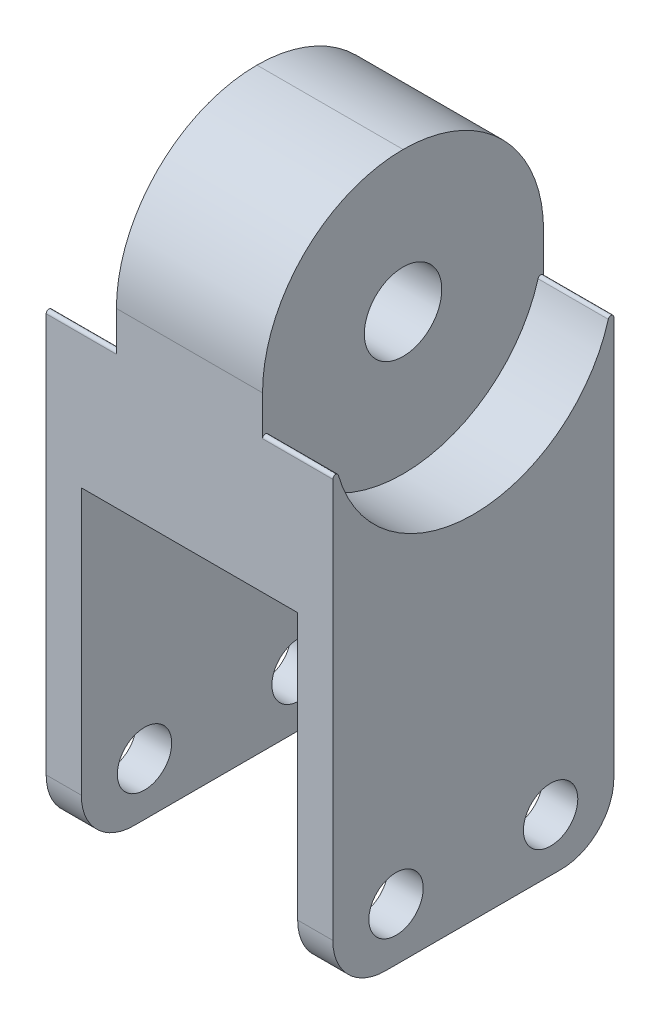
ISO-10303-21;
HEADER;
FILE_DESCRIPTION(('STEP AP214'),'2;1');
FILE_NAME('part.step','',(''),(''),'','','');
FILE_SCHEMA(('AUTOMOTIVE_DESIGN { 1 0 10303 214 1 1 1 1 }'));
ENDSEC;
DATA;
#1=APPLICATION_CONTEXT('core data for automotive mechanical design processes');
#2=APPLICATION_PROTOCOL_DEFINITION('international standard','automotive_design',2000,#1);
#3=PRODUCT_CONTEXT('',#1,'mechanical');
#4=PRODUCT('Part','Part','',(#3));
#5=PRODUCT_RELATED_PRODUCT_CATEGORY('part','',(#4));
#6=PRODUCT_DEFINITION_FORMATION('','',#4);
#7=PRODUCT_DEFINITION_CONTEXT('part definition',#1,'design');
#8=PRODUCT_DEFINITION('design','',#6,#7);
#9=PRODUCT_DEFINITION_SHAPE('','',#8);
#10=(LENGTH_UNIT() NAMED_UNIT(*) SI_UNIT(.MILLI.,.METRE.));
#11=(NAMED_UNIT(*) PLANE_ANGLE_UNIT() SI_UNIT($,.RADIAN.));
#12=(NAMED_UNIT(*) SI_UNIT($,.STERADIAN.) SOLID_ANGLE_UNIT());
#13=UNCERTAINTY_MEASURE_WITH_UNIT(LENGTH_MEASURE(1.E-05),#10,'distance_accuracy_value','');
#14=(GEOMETRIC_REPRESENTATION_CONTEXT(3) GLOBAL_UNCERTAINTY_ASSIGNED_CONTEXT((#13)) GLOBAL_UNIT_ASSIGNED_CONTEXT((#10,
#11,#12)) REPRESENTATION_CONTEXT('',''));
#15=CARTESIAN_POINT('',(0.,0.,0.));
#16=DIRECTION('',(0.,0.,1.));
#17=DIRECTION('',(1.,0.,0.));
#18=AXIS2_PLACEMENT_3D('',#15,#16,#17);
#19=CARTESIAN_POINT('',(-6.604,12.954,12.7));
#20=DIRECTION('',(1.,0.,0.));
#21=DIRECTION('',(0.,0.,-1.));
#22=AXIS2_PLACEMENT_3D('',#19,#20,#21);
#23=PLANE('',#22);
#24=CARTESIAN_POINT('',(-6.604,21.8078975515723,12.446));
#25=DIRECTION('',(1.,0.,0.));
#26=DIRECTION('',(0.,0.,-1.));
#27=AXIS2_PLACEMENT_3D('',#24,#25,#26);
#28=CIRCLE('',#27,0.254);
#29=CARTESIAN_POINT('',(-6.604,21.8078975515723,12.7));
#30=VERTEX_POINT('',#29);
#31=CARTESIAN_POINT('',(-6.604,21.8783309329141,12.2019607843137));
#32=VERTEX_POINT('',#31);
#33=EDGE_CURVE('E214',#30,#32,#28,.F.);
#34=ORIENTED_EDGE('',*,*,#33,.F.);
#35=DIRECTION('',(0.,-1.,0.));
#36=VECTOR('',#35,1.);
#37=CARTESIAN_POINT('',(-6.604,12.954,12.7));
#38=LINE('',#37,#36);
#39=CARTESIAN_POINT('',(-6.604,25.4,12.7));
#40=VERTEX_POINT('',#39);
#41=EDGE_CURVE('E188',#40,#30,#38,.T.);
#42=ORIENTED_EDGE('',*,*,#41,.F.);
#43=CARTESIAN_POINT('',(-6.604,25.4,0.));
#44=DIRECTION('',(1.,0.,0.));
#45=DIRECTION('',(0.,0.,-1.));
#46=AXIS2_PLACEMENT_3D('',#43,#44,#45);
#47=CIRCLE('',#46,12.7);
#48=CARTESIAN_POINT('',(-6.604,38.1,0.));
#49=VERTEX_POINT('',#48);
#50=EDGE_CURVE('E353',#40,#49,#47,.F.);
#51=ORIENTED_EDGE('',*,*,#50,.T.);
#52=CARTESIAN_POINT('',(-6.604,25.4,0.));
#53=DIRECTION('',(1.,0.,0.));
#54=DIRECTION('',(0.,0.,-1.));
#55=AXIS2_PLACEMENT_3D('',#52,#53,#54);
#56=CIRCLE('',#55,12.7);
#57=CARTESIAN_POINT('',(-6.604,25.4,-12.7));
#58=VERTEX_POINT('',#57);
#59=EDGE_CURVE('E351',#49,#58,#56,.F.);
#60=ORIENTED_EDGE('',*,*,#59,.T.);
#61=DIRECTION('',(0.,-1.,0.));
#62=VECTOR('',#61,1.);
#63=CARTESIAN_POINT('',(-6.604,12.954,-12.7));
#64=LINE('',#63,#62);
#65=CARTESIAN_POINT('',(-6.604,21.8078975515723,-12.7));
#66=VERTEX_POINT('',#65);
#67=EDGE_CURVE('E268',#58,#66,#64,.T.);
#68=ORIENTED_EDGE('',*,*,#67,.T.);
#69=CARTESIAN_POINT('',(-6.604,21.8078975515723,-12.446));
#70=DIRECTION('',(1.,0.,0.));
#71=DIRECTION('',(0.,0.,-1.));
#72=AXIS2_PLACEMENT_3D('',#69,#70,#71);
#73=CIRCLE('',#72,0.254);
#74=CARTESIAN_POINT('',(-6.604,21.8783309329141,-12.2019607843137));
#75=VERTEX_POINT('',#74);
#76=EDGE_CURVE('E49',#75,#66,#73,.F.);
#77=ORIENTED_EDGE('',*,*,#76,.F.);
#78=CARTESIAN_POINT('',(-6.604,25.4,0.));
#79=DIRECTION('',(1.,0.,0.));
#80=DIRECTION('',(0.,0.,-1.));
#81=AXIS2_PLACEMENT_3D('',#78,#79,#80);
#82=CIRCLE('',#81,12.7);
#83=EDGE_CURVE('E237',#75,#32,#82,.F.);
#84=ORIENTED_EDGE('',*,*,#83,.T.);
#85=EDGE_LOOP('',(#34,#42,#51,#60,#68,#77,#84));
#86=FACE_BOUND('',#85,.T.);
#87=CARTESIAN_POINT('',(-6.604,25.4,0.));
#88=DIRECTION('',(-1.,0.,0.));
#89=DIRECTION('',(0.,0.,1.));
#90=AXIS2_PLACEMENT_3D('',#87,#88,#89);
#91=CIRCLE('',#90,3.5);
#92=CARTESIAN_POINT('',(-6.604,25.4,3.5));
#93=VERTEX_POINT('',#92);
#94=EDGE_CURVE('E239',#93,#93,#91,.T.);
#95=ORIENTED_EDGE('',*,*,#94,.F.);
#96=EDGE_LOOP('',(#95));
#97=FACE_BOUND('',#96,.T.);
#98=ADVANCED_FACE('F34',(#86,#97),#23,.F.);
#99=CARTESIAN_POINT('',(6.604,38.1,12.7));
#100=DIRECTION('',(-1.,0.,0.));
#101=DIRECTION('',(0.,0.,1.));
#102=AXIS2_PLACEMENT_3D('',#99,#100,#101);
#103=PLANE('',#102);
#104=CARTESIAN_POINT('',(6.604,21.8078975515723,12.446));
#105=DIRECTION('',(-1.,0.,0.));
#106=DIRECTION('',(0.,0.,1.));
#107=AXIS2_PLACEMENT_3D('',#104,#105,#106);
#108=CIRCLE('',#107,0.254);
#109=CARTESIAN_POINT('',(6.604,21.8783309329141,12.2019607843137));
#110=VERTEX_POINT('',#109);
#111=CARTESIAN_POINT('',(6.604,21.8078975515723,12.7));
#112=VERTEX_POINT('',#111);
#113=EDGE_CURVE('E212',#110,#112,#108,.F.);
#114=ORIENTED_EDGE('',*,*,#113,.F.);
#115=CARTESIAN_POINT('',(6.604,25.4,0.));
#116=DIRECTION('',(-1.,0.,0.));
#117=DIRECTION('',(0.,0.,1.));
#118=AXIS2_PLACEMENT_3D('',#115,#116,#117);
#119=CIRCLE('',#118,12.7);
#120=CARTESIAN_POINT('',(6.604,21.8783309329141,-12.2019607843137));
#121=VERTEX_POINT('',#120);
#122=EDGE_CURVE('E11',#110,#121,#119,.F.);
#123=ORIENTED_EDGE('',*,*,#122,.T.);
#124=CARTESIAN_POINT('',(6.604,21.8078975515723,-12.446));
#125=DIRECTION('',(-1.,0.,0.));
#126=DIRECTION('',(0.,0.,1.));
#127=AXIS2_PLACEMENT_3D('',#124,#125,#126);
#128=CIRCLE('',#127,0.254);
#129=CARTESIAN_POINT('',(6.604,21.8078975515723,-12.7));
#130=VERTEX_POINT('',#129);
#131=EDGE_CURVE('E223',#130,#121,#128,.F.);
#132=ORIENTED_EDGE('',*,*,#131,.F.);
#133=DIRECTION('',(0.,1.,0.));
#134=VECTOR('',#133,1.);
#135=CARTESIAN_POINT('',(6.604,38.1,-12.7));
#136=LINE('',#135,#134);
#137=CARTESIAN_POINT('',(6.604,25.4,-12.7));
#138=VERTEX_POINT('',#137);
#139=EDGE_CURVE('E269',#130,#138,#136,.T.);
#140=ORIENTED_EDGE('',*,*,#139,.T.);
#141=CARTESIAN_POINT('',(6.604,25.4,0.));
#142=DIRECTION('',(-1.,0.,0.));
#143=DIRECTION('',(0.,0.,1.));
#144=AXIS2_PLACEMENT_3D('',#141,#142,#143);
#145=CIRCLE('',#144,12.7);
#146=CARTESIAN_POINT('',(6.604,38.1,0.));
#147=VERTEX_POINT('',#146);
#148=EDGE_CURVE('E355',#138,#147,#145,.F.);
#149=ORIENTED_EDGE('',*,*,#148,.T.);
#150=CARTESIAN_POINT('',(6.604,25.4,0.));
#151=DIRECTION('',(-1.,0.,0.));
#152=DIRECTION('',(0.,0.,1.));
#153=AXIS2_PLACEMENT_3D('',#150,#151,#152);
#154=CIRCLE('',#153,12.7);
#155=CARTESIAN_POINT('',(6.604,25.4,12.7));
#156=VERTEX_POINT('',#155);
#157=EDGE_CURVE('E357',#147,#156,#154,.F.);
#158=ORIENTED_EDGE('',*,*,#157,.T.);
#159=DIRECTION('',(0.,1.,0.));
#160=VECTOR('',#159,1.);
#161=CARTESIAN_POINT('',(6.604,38.1,12.7));
#162=LINE('',#161,#160);
#163=EDGE_CURVE('E279',#112,#156,#162,.T.);
#164=ORIENTED_EDGE('',*,*,#163,.F.);
#165=EDGE_LOOP('',(#114,#123,#132,#140,#149,#158,#164));
#166=FACE_BOUND('',#165,.T.);
#167=CARTESIAN_POINT('',(6.604,25.4,0.));
#168=DIRECTION('',(-1.,0.,0.));
#169=DIRECTION('',(0.,0.,1.));
#170=AXIS2_PLACEMENT_3D('',#167,#168,#169);
#171=CIRCLE('',#170,3.5);
#172=CARTESIAN_POINT('',(6.604,25.4,3.5));
#173=VERTEX_POINT('',#172);
#174=EDGE_CURVE('E242',#173,#173,#171,.T.);
#175=ORIENTED_EDGE('',*,*,#174,.T.);
#176=EDGE_LOOP('',(#175));
#177=FACE_BOUND('',#176,.T.);
#178=ADVANCED_FACE('F398',(#166,#177),#103,.F.);
#179=CARTESIAN_POINT('',(12.954,12.954,12.7));
#180=DIRECTION('',(-1.,0.,0.));
#181=DIRECTION('',(0.,-1.,0.));
#182=AXIS2_PLACEMENT_3D('',#179,#180,#181);
#183=PLANE('',#182);
#184=CARTESIAN_POINT('',(12.954,-14.2875,6.985));
#185=DIRECTION('',(1.,0.,0.));
#186=DIRECTION('',(0.,0.,-1.));
#187=AXIS2_PLACEMENT_3D('',#184,#185,#186);
#188=CIRCLE('',#187,2.45745);
#189=CARTESIAN_POINT('',(12.954,-14.2875,4.52755));
#190=VERTEX_POINT('',#189);
#191=EDGE_CURVE('E246',#190,#190,#188,.T.);
#192=ORIENTED_EDGE('',*,*,#191,.F.);
#193=EDGE_LOOP('',(#192));
#194=FACE_BOUND('',#193,.T.);
#195=CARTESIAN_POINT('',(12.954,25.4,0.));
#196=DIRECTION('',(-1.,0.,0.));
#197=DIRECTION('',(0.,-1.,0.));
#198=AXIS2_PLACEMENT_3D('',#195,#196,#197);
#199=CIRCLE('',#198,12.7);
#200=CARTESIAN_POINT('',(12.954,21.8783309329141,-12.2019607843137));
#201=VERTEX_POINT('',#200);
#202=CARTESIAN_POINT('',(12.954,21.8783309329141,12.2019607843137));
#203=VERTEX_POINT('',#202);
#204=EDGE_CURVE('E217',#201,#203,#199,.T.);
#205=ORIENTED_EDGE('',*,*,#204,.T.);
#206=CARTESIAN_POINT('',(12.954,21.8078975515723,12.446));
#207=DIRECTION('',(-1.,0.,0.));
#208=DIRECTION('',(0.,-1.,0.));
#209=AXIS2_PLACEMENT_3D('',#206,#207,#208);
#210=CIRCLE('',#209,0.254);
#211=CARTESIAN_POINT('',(12.954,21.8078975515723,12.7));
#212=VERTEX_POINT('',#211);
#213=EDGE_CURVE('E209',#212,#203,#210,.T.);
#214=ORIENTED_EDGE('',*,*,#213,.F.);
#215=DIRECTION('',(0.,1.,0.));
#216=VECTOR('',#215,1.);
#217=CARTESIAN_POINT('',(12.954,12.954,12.7));
#218=LINE('',#217,#216);
#219=CARTESIAN_POINT('',(12.954,-14.2875,12.7));
#220=VERTEX_POINT('',#219);
#221=EDGE_CURVE('E277',#220,#212,#218,.T.);
#222=ORIENTED_EDGE('',*,*,#221,.F.);
#223=CARTESIAN_POINT('',(12.954,-14.2875,7.9375));
#224=DIRECTION('',(-1.,0.,0.));
#225=DIRECTION('',(0.,-1.,0.));
#226=AXIS2_PLACEMENT_3D('',#223,#224,#225);
#227=CIRCLE('',#226,4.7625);
#228=CARTESIAN_POINT('',(12.954,-19.05,7.9375));
#229=VERTEX_POINT('',#228);
#230=EDGE_CURVE('E341',#220,#229,#227,.F.);
#231=ORIENTED_EDGE('',*,*,#230,.T.);
#232=DIRECTION('',(0.,0.,-1.));
#233=VECTOR('',#232,1.);
#234=CARTESIAN_POINT('',(12.954,-19.05,12.7));
#235=LINE('',#234,#233);
#236=CARTESIAN_POINT('',(12.954,-19.05,-7.9375));
#237=VERTEX_POINT('',#236);
#238=EDGE_CURVE('E281',#229,#237,#235,.T.);
#239=ORIENTED_EDGE('',*,*,#238,.T.);
#240=CARTESIAN_POINT('',(12.954,-14.2875,-7.9375));
#241=DIRECTION('',(-1.,0.,0.));
#242=DIRECTION('',(0.,-1.,0.));
#243=AXIS2_PLACEMENT_3D('',#240,#241,#242);
#244=CIRCLE('',#243,4.7625);
#245=CARTESIAN_POINT('',(12.954,-14.2875,-12.7));
#246=VERTEX_POINT('',#245);
#247=EDGE_CURVE('E343',#237,#246,#244,.F.);
#248=ORIENTED_EDGE('',*,*,#247,.T.);
#249=DIRECTION('',(0.,1.,0.));
#250=VECTOR('',#249,1.);
#251=CARTESIAN_POINT('',(12.954,12.954,-12.7));
#252=LINE('',#251,#250);
#253=CARTESIAN_POINT('',(12.954,21.8078975515723,-12.7));
#254=VERTEX_POINT('',#253);
#255=EDGE_CURVE('E293',#246,#254,#252,.T.);
#256=ORIENTED_EDGE('',*,*,#255,.T.);
#257=CARTESIAN_POINT('',(12.954,21.8078975515723,-12.446));
#258=DIRECTION('',(-1.,0.,0.));
#259=DIRECTION('',(0.,-1.,0.));
#260=AXIS2_PLACEMENT_3D('',#257,#258,#259);
#261=CIRCLE('',#260,0.254);
#262=EDGE_CURVE('E219',#201,#254,#261,.T.);
#263=ORIENTED_EDGE('',*,*,#262,.F.);
#264=EDGE_LOOP('',(#205,#214,#222,#231,#239,#248,#256,#263));
#265=FACE_BOUND('',#264,.T.);
#266=CARTESIAN_POINT('',(12.954,-14.2875,-6.985));
#267=DIRECTION('',(1.,0.,0.));
#268=DIRECTION('',(0.,0.,-1.));
#269=AXIS2_PLACEMENT_3D('',#266,#267,#268);
#270=CIRCLE('',#269,2.45745);
#271=CARTESIAN_POINT('',(12.954,-14.2875,-9.44245));
#272=VERTEX_POINT('',#271);
#273=EDGE_CURVE('E256',#272,#272,#270,.T.);
#274=ORIENTED_EDGE('',*,*,#273,.F.);
#275=EDGE_LOOP('',(#274));
#276=FACE_BOUND('',#275,.T.);
#277=ADVANCED_FACE('F403',(#194,#265,#276),#183,.F.);
#278=CARTESIAN_POINT('',(-12.954,-19.05,12.7));
#279=DIRECTION('',(1.,0.,0.));
#280=DIRECTION('',(0.,0.,-1.));
#281=AXIS2_PLACEMENT_3D('',#278,#279,#280);
#282=PLANE('',#281);
#283=CARTESIAN_POINT('',(-12.954,-14.2875,6.985));
#284=DIRECTION('',(1.,0.,0.));
#285=DIRECTION('',(0.,0.,-1.));
#286=AXIS2_PLACEMENT_3D('',#283,#284,#285);
#287=CIRCLE('',#286,2.45744999999999);
#288=CARTESIAN_POINT('',(-12.954,-14.2875,4.52755000000001));
#289=VERTEX_POINT('',#288);
#290=EDGE_CURVE('E249',#289,#289,#287,.T.);
#291=ORIENTED_EDGE('',*,*,#290,.T.);
#292=EDGE_LOOP('',(#291));
#293=FACE_BOUND('',#292,.T.);
#294=CARTESIAN_POINT('',(-12.954,-14.2875,-6.985));
#295=DIRECTION('',(1.,0.,0.));
#296=DIRECTION('',(0.,0.,-1.));
#297=AXIS2_PLACEMENT_3D('',#294,#295,#296);
#298=CIRCLE('',#297,2.45744999999999);
#299=CARTESIAN_POINT('',(-12.954,-14.2875,-9.44244999999999));
#300=VERTEX_POINT('',#299);
#301=EDGE_CURVE('E259',#300,#300,#298,.T.);
#302=ORIENTED_EDGE('',*,*,#301,.T.);
#303=EDGE_LOOP('',(#302));
#304=FACE_BOUND('',#303,.T.);
#305=CARTESIAN_POINT('',(-12.954,21.8078975515723,12.446));
#306=DIRECTION('',(1.,0.,0.));
#307=DIRECTION('',(0.,0.,-1.));
#308=AXIS2_PLACEMENT_3D('',#305,#306,#307);
#309=CIRCLE('',#308,0.254);
#310=CARTESIAN_POINT('',(-12.954,21.8783309329141,12.2019607843137));
#311=VERTEX_POINT('',#310);
#312=CARTESIAN_POINT('',(-12.954,21.8078975515723,12.7));
#313=VERTEX_POINT('',#312);
#314=EDGE_CURVE('E180',#311,#313,#309,.T.);
#315=ORIENTED_EDGE('',*,*,#314,.F.);
#316=CARTESIAN_POINT('',(-12.954,25.4,0.));
#317=DIRECTION('',(1.,0.,0.));
#318=DIRECTION('',(0.,0.,-1.));
#319=AXIS2_PLACEMENT_3D('',#316,#317,#318);
#320=CIRCLE('',#319,12.7);
#321=CARTESIAN_POINT('',(-12.954,21.8783309329141,-12.2019607843137));
#322=VERTEX_POINT('',#321);
#323=EDGE_CURVE('E226',#311,#322,#320,.T.);
#324=ORIENTED_EDGE('',*,*,#323,.T.);
#325=CARTESIAN_POINT('',(-12.954,21.8078975515723,-12.446));
#326=DIRECTION('',(1.,0.,0.));
#327=DIRECTION('',(0.,0.,-1.));
#328=AXIS2_PLACEMENT_3D('',#325,#326,#327);
#329=CIRCLE('',#328,0.254);
#330=CARTESIAN_POINT('',(-12.954,21.8078975515723,-12.7));
#331=VERTEX_POINT('',#330);
#332=EDGE_CURVE('E216',#331,#322,#329,.T.);
#333=ORIENTED_EDGE('',*,*,#332,.F.);
#334=DIRECTION('',(0.,-1.,0.));
#335=VECTOR('',#334,1.);
#336=CARTESIAN_POINT('',(-12.954,-19.05,-12.7));
#337=LINE('',#336,#335);
#338=CARTESIAN_POINT('',(-12.954,-14.2875,-12.7));
#339=VERTEX_POINT('',#338);
#340=EDGE_CURVE('E283',#331,#339,#337,.T.);
#341=ORIENTED_EDGE('',*,*,#340,.T.);
#342=CARTESIAN_POINT('',(-12.954,-14.2875,-7.9375));
#343=DIRECTION('',(1.,0.,0.));
#344=DIRECTION('',(0.,0.,-1.));
#345=AXIS2_PLACEMENT_3D('',#342,#343,#344);
#346=CIRCLE('',#345,4.7625);
#347=CARTESIAN_POINT('',(-12.954,-19.05,-7.9375));
#348=VERTEX_POINT('',#347);
#349=EDGE_CURVE('E329',#339,#348,#346,.F.);
#350=ORIENTED_EDGE('',*,*,#349,.T.);
#351=DIRECTION('',(0.,0.,-1.));
#352=VECTOR('',#351,1.);
#353=CARTESIAN_POINT('',(-12.954,-19.05,12.7));
#354=LINE('',#353,#352);
#355=CARTESIAN_POINT('',(-12.954,-19.05,7.9375));
#356=VERTEX_POINT('',#355);
#357=EDGE_CURVE('E310',#356,#348,#354,.T.);
#358=ORIENTED_EDGE('',*,*,#357,.F.);
#359=CARTESIAN_POINT('',(-12.954,-14.2875,7.9375));
#360=DIRECTION('',(1.,0.,0.));
#361=DIRECTION('',(0.,0.,-1.));
#362=AXIS2_PLACEMENT_3D('',#359,#360,#361);
#363=CIRCLE('',#362,4.7625);
#364=CARTESIAN_POINT('',(-12.954,-14.2875,12.7));
#365=VERTEX_POINT('',#364);
#366=EDGE_CURVE('E183',#356,#365,#363,.F.);
#367=ORIENTED_EDGE('',*,*,#366,.T.);
#368=DIRECTION('',(0.,-1.,0.));
#369=VECTOR('',#368,1.);
#370=CARTESIAN_POINT('',(-12.954,-19.05,12.7));
#371=LINE('',#370,#369);
#372=EDGE_CURVE('E175',#313,#365,#371,.T.);
#373=ORIENTED_EDGE('',*,*,#372,.F.);
#374=EDGE_LOOP('',(#315,#324,#333,#341,#350,#358,#367,#373));
#375=FACE_BOUND('',#374,.T.);
#376=ADVANCED_FACE('F177',(#293,#304,#375),#282,.F.);
#377=CARTESIAN_POINT('',(-9.779,-19.05,12.7));
#378=DIRECTION('',(0.,1.,0.));
#379=DIRECTION('',(-1.,0.,0.));
#380=AXIS2_PLACEMENT_3D('',#377,#378,#379);
#381=PLANE('',#380);
#382=DIRECTION('',(0.,0.,-1.));
#383=VECTOR('',#382,1.);
#384=CARTESIAN_POINT('',(-9.779,-19.05,12.7));
#385=LINE('',#384,#383);
#386=CARTESIAN_POINT('',(-9.779,-19.05,7.9375));
#387=VERTEX_POINT('',#386);
#388=CARTESIAN_POINT('',(-9.779,-19.05,-7.9375));
#389=VERTEX_POINT('',#388);
#390=EDGE_CURVE('E307',#387,#389,#385,.T.);
#391=ORIENTED_EDGE('',*,*,#390,.F.);
#392=DIRECTION('',(1.,0.,0.));
#393=VECTOR('',#392,1.);
#394=CARTESIAN_POINT('',(-9.779,-19.05,7.9375));
#395=LINE('',#394,#393);
#396=EDGE_CURVE('E327',#387,#356,#395,.F.);
#397=ORIENTED_EDGE('',*,*,#396,.T.);
#398=ORIENTED_EDGE('',*,*,#357,.T.);
#399=DIRECTION('',(1.,0.,0.));
#400=VECTOR('',#399,1.);
#401=CARTESIAN_POINT('',(-9.779,-19.05,-7.9375));
#402=LINE('',#401,#400);
#403=EDGE_CURVE('E324',#348,#389,#402,.T.);
#404=ORIENTED_EDGE('',*,*,#403,.T.);
#405=EDGE_LOOP('',(#391,#397,#398,#404));
#406=FACE_BOUND('',#405,.T.);
#407=ADVANCED_FACE('F525',(#406),#381,.F.);
#408=CARTESIAN_POINT('',(-9.779,9.779,12.7));
#409=DIRECTION('',(-1.,0.,0.));
#410=DIRECTION('',(0.,-1.,0.));
#411=AXIS2_PLACEMENT_3D('',#408,#409,#410);
#412=PLANE('',#411);
#413=CARTESIAN_POINT('',(-9.779,-14.2875,6.985));
#414=DIRECTION('',(-1.,0.,0.));
#415=DIRECTION('',(0.,-1.,0.));
#416=AXIS2_PLACEMENT_3D('',#413,#414,#415);
#417=CIRCLE('',#416,2.45744999999999);
#418=CARTESIAN_POINT('',(-9.779,-16.74495,6.985));
#419=VERTEX_POINT('',#418);
#420=EDGE_CURVE('E252',#419,#419,#417,.T.);
#421=ORIENTED_EDGE('',*,*,#420,.T.);
#422=EDGE_LOOP('',(#421));
#423=FACE_BOUND('',#422,.T.);
#424=CARTESIAN_POINT('',(-9.779,-14.2875,-6.985));
#425=DIRECTION('',(-1.,0.,0.));
#426=DIRECTION('',(0.,-1.,0.));
#427=AXIS2_PLACEMENT_3D('',#424,#425,#426);
#428=CIRCLE('',#427,2.45744999999999);
#429=CARTESIAN_POINT('',(-9.779,-16.74495,-6.985));
#430=VERTEX_POINT('',#429);
#431=EDGE_CURVE('E262',#430,#430,#428,.T.);
#432=ORIENTED_EDGE('',*,*,#431,.T.);
#433=EDGE_LOOP('',(#432));
#434=FACE_BOUND('',#433,.T.);
#435=DIRECTION('',(0.,1.,0.));
#436=VECTOR('',#435,1.);
#437=CARTESIAN_POINT('',(-9.779,9.779,12.7));
#438=LINE('',#437,#436);
#439=CARTESIAN_POINT('',(-9.779,-14.2875,12.7));
#440=VERTEX_POINT('',#439);
#441=CARTESIAN_POINT('',(-9.779,9.779,12.7));
#442=VERTEX_POINT('',#441);
#443=EDGE_CURVE('E187',#440,#442,#438,.T.);
#444=ORIENTED_EDGE('',*,*,#443,.F.);
#445=CARTESIAN_POINT('',(-9.779,-14.2875,7.9375));
#446=DIRECTION('',(-1.,0.,0.));
#447=DIRECTION('',(0.,-1.,0.));
#448=AXIS2_PLACEMENT_3D('',#445,#446,#447);
#449=CIRCLE('',#448,4.7625);
#450=EDGE_CURVE('E322',#440,#387,#449,.F.);
#451=ORIENTED_EDGE('',*,*,#450,.T.);
#452=ORIENTED_EDGE('',*,*,#390,.T.);
#453=CARTESIAN_POINT('',(-9.779,-14.2875,-7.9375));
#454=DIRECTION('',(-1.,0.,0.));
#455=DIRECTION('',(0.,-1.,0.));
#456=AXIS2_PLACEMENT_3D('',#453,#454,#455);
#457=CIRCLE('',#456,4.7625);
#458=CARTESIAN_POINT('',(-9.779,-14.2875,-12.7));
#459=VERTEX_POINT('',#458);
#460=EDGE_CURVE('E320',#389,#459,#457,.F.);
#461=ORIENTED_EDGE('',*,*,#460,.T.);
#462=DIRECTION('',(0.,1.,0.));
#463=VECTOR('',#462,1.);
#464=CARTESIAN_POINT('',(-9.779,9.779,-12.7));
#465=LINE('',#464,#463);
#466=CARTESIAN_POINT('',(-9.779,9.779,-12.7));
#467=VERTEX_POINT('',#466);
#468=EDGE_CURVE('E286',#459,#467,#465,.T.);
#469=ORIENTED_EDGE('',*,*,#468,.T.);
#470=DIRECTION('',(0.,0.,-1.));
#471=VECTOR('',#470,1.);
#472=CARTESIAN_POINT('',(-9.779,9.779,12.7));
#473=LINE('',#472,#471);
#474=EDGE_CURVE('E304',#442,#467,#473,.T.);
#475=ORIENTED_EDGE('',*,*,#474,.F.);
#476=EDGE_LOOP('',(#444,#451,#452,#461,#469,#475));
#477=FACE_BOUND('',#476,.T.);
#478=ADVANCED_FACE('F518',(#423,#434,#477),#412,.F.);
#479=CARTESIAN_POINT('',(-9.779,9.779,12.7));
#480=DIRECTION('',(0.,1.,0.));
#481=DIRECTION('',(0.,0.,1.));
#482=AXIS2_PLACEMENT_3D('',#479,#480,#481);
#483=PLANE('',#482);
#484=DIRECTION('',(1.,0.,0.));
#485=VECTOR('',#484,1.);
#486=CARTESIAN_POINT('',(-9.779,9.779,-12.7));
#487=LINE('',#486,#485);
#488=CARTESIAN_POINT('',(9.779,9.779,-12.7));
#489=VERTEX_POINT('',#488);
#490=EDGE_CURVE('E288',#467,#489,#487,.T.);
#491=ORIENTED_EDGE('',*,*,#490,.T.);
#492=DIRECTION('',(0.,0.,-1.));
#493=VECTOR('',#492,1.);
#494=CARTESIAN_POINT('',(9.779,9.779,12.7));
#495=LINE('',#494,#493);
#496=CARTESIAN_POINT('',(9.779,9.779,12.7));
#497=VERTEX_POINT('',#496);
#498=EDGE_CURVE('E301',#497,#489,#495,.T.);
#499=ORIENTED_EDGE('',*,*,#498,.F.);
#500=DIRECTION('',(1.,0.,0.));
#501=VECTOR('',#500,1.);
#502=CARTESIAN_POINT('',(-9.779,9.779,12.7));
#503=LINE('',#502,#501);
#504=EDGE_CURVE('E272',#442,#497,#503,.T.);
#505=ORIENTED_EDGE('',*,*,#504,.F.);
#506=ORIENTED_EDGE('',*,*,#474,.T.);
#507=EDGE_LOOP('',(#491,#499,#505,#506));
#508=FACE_BOUND('',#507,.T.);
#509=ADVANCED_FACE('F510',(#508),#483,.F.);
#510=CARTESIAN_POINT('',(9.779,-19.05,12.7));
#511=DIRECTION('',(1.,0.,0.));
#512=DIRECTION('',(0.,1.,0.));
#513=AXIS2_PLACEMENT_3D('',#510,#511,#512);
#514=PLANE('',#513);
#515=CARTESIAN_POINT('',(9.779,-14.2875,6.985));
#516=DIRECTION('',(1.,0.,0.));
#517=DIRECTION('',(0.,1.,0.));
#518=AXIS2_PLACEMENT_3D('',#515,#516,#517);
#519=CIRCLE('',#518,2.45744999999999);
#520=CARTESIAN_POINT('',(9.779,-11.83005,6.985));
#521=VERTEX_POINT('',#520);
#522=EDGE_CURVE('E253',#521,#521,#519,.T.);
#523=ORIENTED_EDGE('',*,*,#522,.T.);
#524=EDGE_LOOP('',(#523));
#525=FACE_BOUND('',#524,.T.);
#526=CARTESIAN_POINT('',(9.779,-14.2875,-6.985));
#527=DIRECTION('',(1.,0.,0.));
#528=DIRECTION('',(0.,1.,0.));
#529=AXIS2_PLACEMENT_3D('',#526,#527,#528);
#530=CIRCLE('',#529,2.45744999999999);
#531=CARTESIAN_POINT('',(9.779,-11.83005,-6.985));
#532=VERTEX_POINT('',#531);
#533=EDGE_CURVE('E265',#532,#532,#530,.T.);
#534=ORIENTED_EDGE('',*,*,#533,.T.);
#535=EDGE_LOOP('',(#534));
#536=FACE_BOUND('',#535,.T.);
#537=DIRECTION('',(0.,-1.,0.));
#538=VECTOR('',#537,1.);
#539=CARTESIAN_POINT('',(9.779,-19.05,-12.7));
#540=LINE('',#539,#538);
#541=CARTESIAN_POINT('',(9.779,-14.2875,-12.7));
#542=VERTEX_POINT('',#541);
#543=EDGE_CURVE('E290',#489,#542,#540,.T.);
#544=ORIENTED_EDGE('',*,*,#543,.T.);
#545=CARTESIAN_POINT('',(9.779,-14.2875,-7.9375));
#546=DIRECTION('',(1.,0.,0.));
#547=DIRECTION('',(0.,1.,0.));
#548=AXIS2_PLACEMENT_3D('',#545,#546,#547);
#549=CIRCLE('',#548,4.7625);
#550=CARTESIAN_POINT('',(9.779,-19.05,-7.9375));
#551=VERTEX_POINT('',#550);
#552=EDGE_CURVE('E347',#542,#551,#549,.F.);
#553=ORIENTED_EDGE('',*,*,#552,.T.);
#554=DIRECTION('',(0.,0.,-1.));
#555=VECTOR('',#554,1.);
#556=CARTESIAN_POINT('',(9.779,-19.05,12.7));
#557=LINE('',#556,#555);
#558=CARTESIAN_POINT('',(9.779,-19.05,7.9375));
#559=VERTEX_POINT('',#558);
#560=EDGE_CURVE('E298',#559,#551,#557,.T.);
#561=ORIENTED_EDGE('',*,*,#560,.F.);
#562=CARTESIAN_POINT('',(9.779,-14.2875,7.9375));
#563=DIRECTION('',(1.,0.,0.));
#564=DIRECTION('',(0.,1.,0.));
#565=AXIS2_PLACEMENT_3D('',#562,#563,#564);
#566=CIRCLE('',#565,4.7625);
#567=CARTESIAN_POINT('',(9.779,-14.2875,12.7));
#568=VERTEX_POINT('',#567);
#569=EDGE_CURVE('E345',#559,#568,#566,.F.);
#570=ORIENTED_EDGE('',*,*,#569,.T.);
#571=DIRECTION('',(0.,-1.,0.));
#572=VECTOR('',#571,1.);
#573=CARTESIAN_POINT('',(9.779,-19.05,12.7));
#574=LINE('',#573,#572);
#575=EDGE_CURVE('E274',#497,#568,#574,.T.);
#576=ORIENTED_EDGE('',*,*,#575,.F.);
#577=ORIENTED_EDGE('',*,*,#498,.T.);
#578=EDGE_LOOP('',(#544,#553,#561,#570,#576,#577));
#579=FACE_BOUND('',#578,.T.);
#580=ADVANCED_FACE('F502',(#525,#536,#579),#514,.F.);
#581=CARTESIAN_POINT('',(12.954,-19.05,12.7));
#582=DIRECTION('',(0.,1.,0.));
#583=DIRECTION('',(-1.,0.,0.));
#584=AXIS2_PLACEMENT_3D('',#581,#582,#583);
#585=PLANE('',#584);
#586=ORIENTED_EDGE('',*,*,#560,.T.);
#587=DIRECTION('',(1.,0.,0.));
#588=VECTOR('',#587,1.);
#589=CARTESIAN_POINT('',(12.954,-19.05,-7.9375));
#590=LINE('',#589,#588);
#591=EDGE_CURVE('E338',#551,#237,#590,.T.);
#592=ORIENTED_EDGE('',*,*,#591,.T.);
#593=ORIENTED_EDGE('',*,*,#238,.F.);
#594=DIRECTION('',(1.,0.,0.));
#595=VECTOR('',#594,1.);
#596=CARTESIAN_POINT('',(12.954,-19.05,7.9375));
#597=LINE('',#596,#595);
#598=EDGE_CURVE('E336',#229,#559,#597,.F.);
#599=ORIENTED_EDGE('',*,*,#598,.T.);
#600=EDGE_LOOP('',(#586,#592,#593,#599));
#601=FACE_BOUND('',#600,.T.);
#602=ADVANCED_FACE('F495',(#601),#585,.F.);
#603=CARTESIAN_POINT('',(0.,0.,12.7));
#604=DIRECTION('',(0.,0.,-1.));
#605=DIRECTION('',(-1.,0.,0.));
#606=AXIS2_PLACEMENT_3D('',#603,#604,#605);
#607=PLANE('',#606);
#608=DIRECTION('',(-1.,0.,0.));
#609=VECTOR('',#608,1.);
#610=CARTESIAN_POINT('',(26.6082400856865,21.8078975515723,12.7));
#611=LINE('',#610,#609);
#612=EDGE_CURVE('E199',#212,#112,#611,.T.);
#613=ORIENTED_EDGE('',*,*,#612,.T.);
#614=ORIENTED_EDGE('',*,*,#163,.T.);
#615=DIRECTION('',(-1.,0.,0.));
#616=VECTOR('',#615,1.);
#617=CARTESIAN_POINT('',(0.,25.4,12.7));
#618=LINE('',#617,#616);
#619=EDGE_CURVE('E349',#156,#40,#618,.T.);
#620=ORIENTED_EDGE('',*,*,#619,.T.);
#621=ORIENTED_EDGE('',*,*,#41,.T.);
#622=EDGE_CURVE('E191',#30,#313,#611,.T.);
#623=ORIENTED_EDGE('',*,*,#622,.T.);
#624=ORIENTED_EDGE('',*,*,#372,.T.);
#625=DIRECTION('',(1.,0.,0.));
#626=VECTOR('',#625,1.);
#627=CARTESIAN_POINT('',(0.,-14.2875,12.7));
#628=LINE('',#627,#626);
#629=EDGE_CURVE('E318',#365,#440,#628,.T.);
#630=ORIENTED_EDGE('',*,*,#629,.T.);
#631=ORIENTED_EDGE('',*,*,#443,.T.);
#632=ORIENTED_EDGE('',*,*,#504,.T.);
#633=ORIENTED_EDGE('',*,*,#575,.T.);
#634=DIRECTION('',(1.,0.,0.));
#635=VECTOR('',#634,1.);
#636=CARTESIAN_POINT('',(0.,-14.2875,12.7));
#637=LINE('',#636,#635);
#638=EDGE_CURVE('E313',#568,#220,#637,.T.);
#639=ORIENTED_EDGE('',*,*,#638,.T.);
#640=ORIENTED_EDGE('',*,*,#221,.T.);
#641=EDGE_LOOP('',(#613,#614,#620,#621,#623,#624,#630,#631,#632,#633,#639,#640));
#642=FACE_BOUND('',#641,.T.);
#643=ADVANCED_FACE('F193',(#642),#607,.F.);
#644=CARTESIAN_POINT('',(0.,0.,-12.7));
#645=DIRECTION('',(0.,0.,-1.));
#646=DIRECTION('',(-1.,0.,0.));
#647=AXIS2_PLACEMENT_3D('',#644,#645,#646);
#648=PLANE('',#647);
#649=ORIENTED_EDGE('',*,*,#139,.F.);
#650=DIRECTION('',(-1.,0.,0.));
#651=VECTOR('',#650,1.);
#652=CARTESIAN_POINT('',(26.6082400856865,21.8078975515723,-12.7));
#653=LINE('',#652,#651);
#654=EDGE_CURVE('E229',#254,#130,#653,.T.);
#655=ORIENTED_EDGE('',*,*,#654,.F.);
#656=ORIENTED_EDGE('',*,*,#255,.F.);
#657=DIRECTION('',(1.,0.,0.));
#658=VECTOR('',#657,1.);
#659=CARTESIAN_POINT('',(9.779,-14.2875,-12.7));
#660=LINE('',#659,#658);
#661=EDGE_CURVE('E332',#246,#542,#660,.F.);
#662=ORIENTED_EDGE('',*,*,#661,.T.);
#663=ORIENTED_EDGE('',*,*,#543,.F.);
#664=ORIENTED_EDGE('',*,*,#490,.F.);
#665=ORIENTED_EDGE('',*,*,#468,.F.);
#666=DIRECTION('',(1.,0.,0.));
#667=VECTOR('',#666,1.);
#668=CARTESIAN_POINT('',(-12.954,-14.2875,-12.7));
#669=LINE('',#668,#667);
#670=EDGE_CURVE('E334',#459,#339,#669,.F.);
#671=ORIENTED_EDGE('',*,*,#670,.T.);
#672=ORIENTED_EDGE('',*,*,#340,.F.);
#673=EDGE_CURVE('E228',#66,#331,#653,.T.);
#674=ORIENTED_EDGE('',*,*,#673,.F.);
#675=ORIENTED_EDGE('',*,*,#67,.F.);
#676=DIRECTION('',(-1.,0.,0.));
#677=VECTOR('',#676,1.);
#678=CARTESIAN_POINT('',(6.604,25.4,-12.7));
#679=LINE('',#678,#677);
#680=EDGE_CURVE('E42',#58,#138,#679,.F.);
#681=ORIENTED_EDGE('',*,*,#680,.T.);
#682=EDGE_LOOP('',(#649,#655,#656,#662,#663,#664,#665,#671,#672,#674,#675,#681));
#683=FACE_BOUND('',#682,.T.);
#684=ADVANCED_FACE('F376',(#683),#648,.T.);
#685=CARTESIAN_POINT('',(12.954,-14.2875,-6.985));
#686=DIRECTION('',(1.,0.,0.));
#687=DIRECTION('',(0.,0.,-1.));
#688=AXIS2_PLACEMENT_3D('',#685,#686,#687);
#689=CYLINDRICAL_SURFACE('',#688,2.45744999999999);
#690=ORIENTED_EDGE('',*,*,#273,.T.);
#691=EDGE_LOOP('',(#690));
#692=FACE_BOUND('',#691,.T.);
#693=ORIENTED_EDGE('',*,*,#533,.F.);
#694=EDGE_LOOP('',(#693));
#695=FACE_BOUND('',#694,.T.);
#696=ADVANCED_FACE('F473',(#692,#695),#689,.F.);
#697=ORIENTED_EDGE('',*,*,#301,.F.);
#698=EDGE_LOOP('',(#697));
#699=FACE_BOUND('',#698,.T.);
#700=ORIENTED_EDGE('',*,*,#431,.F.);
#701=EDGE_LOOP('',(#700));
#702=FACE_BOUND('',#701,.T.);
#703=ADVANCED_FACE('F466',(#699,#702),#689,.F.);
#704=CARTESIAN_POINT('',(12.954,-14.2875,6.985));
#705=DIRECTION('',(1.,0.,0.));
#706=DIRECTION('',(0.,0.,-1.));
#707=AXIS2_PLACEMENT_3D('',#704,#705,#706);
#708=CYLINDRICAL_SURFACE('',#707,2.45744999999999);
#709=ORIENTED_EDGE('',*,*,#290,.F.);
#710=EDGE_LOOP('',(#709));
#711=FACE_BOUND('',#710,.T.);
#712=ORIENTED_EDGE('',*,*,#420,.F.);
#713=EDGE_LOOP('',(#712));
#714=FACE_BOUND('',#713,.T.);
#715=ADVANCED_FACE('F457',(#711,#714),#708,.F.);
#716=ORIENTED_EDGE('',*,*,#191,.T.);
#717=EDGE_LOOP('',(#716));
#718=FACE_BOUND('',#717,.T.);
#719=ORIENTED_EDGE('',*,*,#522,.F.);
#720=EDGE_LOOP('',(#719));
#721=FACE_BOUND('',#720,.T.);
#722=ADVANCED_FACE('F412',(#718,#721),#708,.F.);
#723=CARTESIAN_POINT('',(0.,-14.2875,7.9375));
#724=DIRECTION('',(1.,0.,0.));
#725=DIRECTION('',(0.,1.,0.));
#726=AXIS2_PLACEMENT_3D('',#723,#724,#725);
#727=CYLINDRICAL_SURFACE('',#726,4.7625);
#728=ORIENTED_EDGE('',*,*,#366,.F.);
#729=ORIENTED_EDGE('',*,*,#396,.F.);
#730=ORIENTED_EDGE('',*,*,#450,.F.);
#731=ORIENTED_EDGE('',*,*,#629,.F.);
#732=EDGE_LOOP('',(#728,#729,#730,#731));
#733=FACE_BOUND('',#732,.T.);
#734=ADVANCED_FACE('F408',(#733),#727,.T.);
#735=CARTESIAN_POINT('',(-9.779,-14.2875,-7.9375));
#736=DIRECTION('',(-1.,0.,0.));
#737=DIRECTION('',(0.,-1.,0.));
#738=AXIS2_PLACEMENT_3D('',#735,#736,#737);
#739=CYLINDRICAL_SURFACE('',#738,4.7625);
#740=ORIENTED_EDGE('',*,*,#349,.F.);
#741=ORIENTED_EDGE('',*,*,#670,.F.);
#742=ORIENTED_EDGE('',*,*,#460,.F.);
#743=ORIENTED_EDGE('',*,*,#403,.F.);
#744=EDGE_LOOP('',(#740,#741,#742,#743));
#745=FACE_BOUND('',#744,.T.);
#746=ADVANCED_FACE('F411',(#745),#739,.T.);
#747=CARTESIAN_POINT('',(12.954,-14.2875,-7.9375));
#748=DIRECTION('',(-1.,0.,0.));
#749=DIRECTION('',(0.,-1.,0.));
#750=AXIS2_PLACEMENT_3D('',#747,#748,#749);
#751=CYLINDRICAL_SURFACE('',#750,4.7625);
#752=ORIENTED_EDGE('',*,*,#552,.F.);
#753=ORIENTED_EDGE('',*,*,#661,.F.);
#754=ORIENTED_EDGE('',*,*,#247,.F.);
#755=ORIENTED_EDGE('',*,*,#591,.F.);
#756=EDGE_LOOP('',(#752,#753,#754,#755));
#757=FACE_BOUND('',#756,.T.);
#758=ADVANCED_FACE('F416',(#757),#751,.T.);
#759=CARTESIAN_POINT('',(0.,-14.2875,7.9375));
#760=DIRECTION('',(1.,0.,0.));
#761=DIRECTION('',(0.,1.,0.));
#762=AXIS2_PLACEMENT_3D('',#759,#760,#761);
#763=CYLINDRICAL_SURFACE('',#762,4.7625);
#764=ORIENTED_EDGE('',*,*,#569,.F.);
#765=ORIENTED_EDGE('',*,*,#598,.F.);
#766=ORIENTED_EDGE('',*,*,#230,.F.);
#767=ORIENTED_EDGE('',*,*,#638,.F.);
#768=EDGE_LOOP('',(#764,#765,#766,#767));
#769=FACE_BOUND('',#768,.T.);
#770=ADVANCED_FACE('F420',(#769),#763,.T.);
#771=CARTESIAN_POINT('',(-6.604,25.4,0.));
#772=DIRECTION('',(1.,0.,0.));
#773=DIRECTION('',(0.,0.,-1.));
#774=AXIS2_PLACEMENT_3D('',#771,#772,#773);
#775=CYLINDRICAL_SURFACE('',#774,12.7);
#776=DIRECTION('',(-1.,0.,0.));
#777=VECTOR('',#776,1.);
#778=CARTESIAN_POINT('',(-6.604,38.1,0.));
#779=LINE('',#778,#777);
#780=EDGE_CURVE('E245',#147,#49,#779,.T.);
#781=ORIENTED_EDGE('',*,*,#780,.F.);
#782=ORIENTED_EDGE('',*,*,#148,.F.);
#783=ORIENTED_EDGE('',*,*,#680,.F.);
#784=ORIENTED_EDGE('',*,*,#59,.F.);
#785=EDGE_LOOP('',(#781,#782,#783,#784));
#786=FACE_BOUND('',#785,.T.);
#787=ADVANCED_FACE('F36',(#786),#775,.T.);
#788=CARTESIAN_POINT('',(0.,25.4,0.));
#789=DIRECTION('',(-1.,0.,0.));
#790=DIRECTION('',(0.,0.,1.));
#791=AXIS2_PLACEMENT_3D('',#788,#789,#790);
#792=CYLINDRICAL_SURFACE('',#791,12.7);
#793=ORIENTED_EDGE('',*,*,#157,.F.);
#794=ORIENTED_EDGE('',*,*,#780,.T.);
#795=ORIENTED_EDGE('',*,*,#50,.F.);
#796=ORIENTED_EDGE('',*,*,#619,.F.);
#797=EDGE_LOOP('',(#793,#794,#795,#796));
#798=FACE_BOUND('',#797,.T.);
#799=ADVANCED_FACE('F365',(#798),#792,.T.);
#800=CARTESIAN_POINT('',(-6.604,25.4,0.));
#801=DIRECTION('',(-1.,0.,0.));
#802=DIRECTION('',(0.,0.,1.));
#803=AXIS2_PLACEMENT_3D('',#800,#801,#802);
#804=CYLINDRICAL_SURFACE('',#803,3.5);
#805=ORIENTED_EDGE('',*,*,#94,.T.);
#806=EDGE_LOOP('',(#805));
#807=FACE_BOUND('',#806,.T.);
#808=ORIENTED_EDGE('',*,*,#174,.F.);
#809=EDGE_LOOP('',(#808));
#810=FACE_BOUND('',#809,.T.);
#811=ADVANCED_FACE('F425',(#807,#810),#804,.F.);
#812=CARTESIAN_POINT('',(26.6082400856865,21.8078975515723,-12.446));
#813=DIRECTION('',(-1.,0.,0.));
#814=DIRECTION('',(0.,0.,1.));
#815=AXIS2_PLACEMENT_3D('',#812,#813,#814);
#816=CYLINDRICAL_SURFACE('',#815,0.254);
#817=ORIENTED_EDGE('',*,*,#654,.T.);
#818=ORIENTED_EDGE('',*,*,#131,.T.);
#819=DIRECTION('',(-1.,0.,0.));
#820=VECTOR('',#819,1.);
#821=CARTESIAN_POINT('',(26.6082400856865,21.8783309329141,-12.2019607843137));
#822=LINE('',#821,#820);
#823=EDGE_CURVE('E220',#201,#121,#822,.T.);
#824=ORIENTED_EDGE('',*,*,#823,.F.);
#825=ORIENTED_EDGE('',*,*,#262,.T.);
#826=EDGE_LOOP('',(#817,#818,#824,#825));
#827=FACE_BOUND('',#826,.T.);
#828=ADVANCED_FACE('F394',(#827),#816,.T.);
#829=CARTESIAN_POINT('',(26.6082400856865,25.4,0.));
#830=DIRECTION('',(-1.,0.,0.));
#831=DIRECTION('',(0.,0.,1.));
#832=AXIS2_PLACEMENT_3D('',#829,#830,#831);
#833=CYLINDRICAL_SURFACE('',#832,12.7);
#834=ORIENTED_EDGE('',*,*,#122,.F.);
#835=DIRECTION('',(-1.,0.,0.));
#836=VECTOR('',#835,1.);
#837=CARTESIAN_POINT('',(26.6082400856865,21.8783309329141,12.2019607843137));
#838=LINE('',#837,#836);
#839=EDGE_CURVE('E200',#203,#110,#838,.T.);
#840=ORIENTED_EDGE('',*,*,#839,.F.);
#841=ORIENTED_EDGE('',*,*,#204,.F.);
#842=ORIENTED_EDGE('',*,*,#823,.T.);
#843=EDGE_LOOP('',(#834,#840,#841,#842));
#844=FACE_BOUND('',#843,.T.);
#845=ADVANCED_FACE('F386',(#844),#833,.F.);
#846=ORIENTED_EDGE('',*,*,#83,.F.);
#847=EDGE_CURVE('E232',#75,#322,#822,.T.);
#848=ORIENTED_EDGE('',*,*,#847,.T.);
#849=ORIENTED_EDGE('',*,*,#323,.F.);
#850=EDGE_CURVE('E205',#32,#311,#838,.T.);
#851=ORIENTED_EDGE('',*,*,#850,.F.);
#852=EDGE_LOOP('',(#846,#848,#849,#851));
#853=FACE_BOUND('',#852,.T.);
#854=ADVANCED_FACE('F384',(#853),#833,.F.);
#855=ORIENTED_EDGE('',*,*,#847,.F.);
#856=ORIENTED_EDGE('',*,*,#76,.T.);
#857=ORIENTED_EDGE('',*,*,#673,.T.);
#858=ORIENTED_EDGE('',*,*,#332,.T.);
#859=EDGE_LOOP('',(#855,#856,#857,#858));
#860=FACE_BOUND('',#859,.T.);
#861=ADVANCED_FACE('F381',(#860),#816,.T.);
#862=CARTESIAN_POINT('',(26.6082400856865,21.8078975515723,12.446));
#863=DIRECTION('',(-1.,0.,0.));
#864=DIRECTION('',(0.,0.,1.));
#865=AXIS2_PLACEMENT_3D('',#862,#863,#864);
#866=CYLINDRICAL_SURFACE('',#865,0.254);
#867=ORIENTED_EDGE('',*,*,#839,.T.);
#868=ORIENTED_EDGE('',*,*,#113,.T.);
#869=ORIENTED_EDGE('',*,*,#612,.F.);
#870=ORIENTED_EDGE('',*,*,#213,.T.);
#871=EDGE_LOOP('',(#867,#868,#869,#870));
#872=FACE_BOUND('',#871,.T.);
#873=ADVANCED_FACE('F392',(#872),#866,.T.);
#874=ORIENTED_EDGE('',*,*,#622,.F.);
#875=ORIENTED_EDGE('',*,*,#33,.T.);
#876=ORIENTED_EDGE('',*,*,#850,.T.);
#877=ORIENTED_EDGE('',*,*,#314,.T.);
#878=EDGE_LOOP('',(#874,#875,#876,#877));
#879=FACE_BOUND('',#878,.T.);
#880=ADVANCED_FACE('F203',(#879),#866,.T.);
#881=CLOSED_SHELL('',(#98,#178,#277,#376,#407,#478,#509,#580,#602,#643,#684,#696,#703,#715,#722,
#734,#746,#758,#770,#787,#799,#811,#828,#845,#854,#861,#873,#880));
#882=MANIFOLD_SOLID_BREP('B2',#881);
#883=ADVANCED_BREP_SHAPE_REPRESENTATION('',(#18,#882),#14);
#884=SHAPE_DEFINITION_REPRESENTATION(#9,#883);
ENDSEC;
END-ISO-10303-21;
